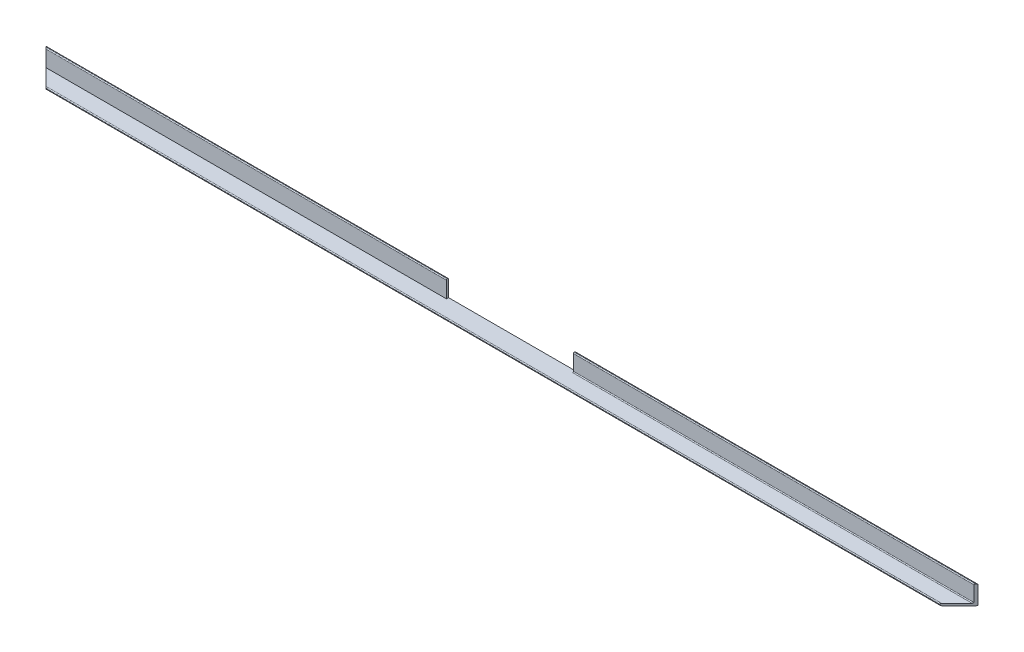
ISO-10303-21;
HEADER;
FILE_DESCRIPTION(('STEP AP214'),'2;1');
FILE_NAME('part.step','',(''),(''),'','','');
FILE_SCHEMA(('AUTOMOTIVE_DESIGN { 1 0 10303 214 1 1 1 1 }'));
ENDSEC;
DATA;
#1=APPLICATION_CONTEXT('core data for automotive mechanical design processes');
#2=APPLICATION_PROTOCOL_DEFINITION('international standard','automotive_design',2000,#1);
#3=PRODUCT_CONTEXT('',#1,'mechanical');
#4=PRODUCT('Part','Part','',(#3));
#5=PRODUCT_RELATED_PRODUCT_CATEGORY('part','',(#4));
#6=PRODUCT_DEFINITION_FORMATION('','',#4);
#7=PRODUCT_DEFINITION_CONTEXT('part definition',#1,'design');
#8=PRODUCT_DEFINITION('design','',#6,#7);
#9=PRODUCT_DEFINITION_SHAPE('','',#8);
#10=(LENGTH_UNIT() NAMED_UNIT(*) SI_UNIT(.MILLI.,.METRE.));
#11=(NAMED_UNIT(*) PLANE_ANGLE_UNIT() SI_UNIT($,.RADIAN.));
#12=(NAMED_UNIT(*) SI_UNIT($,.STERADIAN.) SOLID_ANGLE_UNIT());
#13=UNCERTAINTY_MEASURE_WITH_UNIT(LENGTH_MEASURE(1.E-05),#10,'distance_accuracy_value','');
#14=(GEOMETRIC_REPRESENTATION_CONTEXT(3) GLOBAL_UNCERTAINTY_ASSIGNED_CONTEXT((#13)) GLOBAL_UNIT_ASSIGNED_CONTEXT((#10,
#11,#12)) REPRESENTATION_CONTEXT('',''));
#15=CARTESIAN_POINT('',(0.,0.,0.));
#16=DIRECTION('',(0.,0.,1.));
#17=DIRECTION('',(1.,0.,0.));
#18=AXIS2_PLACEMENT_3D('',#15,#16,#17);
#19=CARTESIAN_POINT('',(-550.,22.5,-8.75));
#20=DIRECTION('',(0.,0.,-1.));
#21=DIRECTION('',(-1.,0.,0.));
#22=AXIS2_PLACEMENT_3D('',#19,#20,#21);
#23=PLANE('',#22);
#24=DIRECTION('',(0.,-1.,0.));
#25=VECTOR('',#24,1.);
#26=CARTESIAN_POINT('',(-75.0000000000002,22.5,-8.75));
#27=LINE('',#26,#25);
#28=CARTESIAN_POINT('',(-75.0000000000002,21.5,-8.75));
#29=VERTEX_POINT('',#28);
#30=CARTESIAN_POINT('',(-75.0000000000002,2.50000000000029,-8.75));
#31=VERTEX_POINT('',#30);
#32=EDGE_CURVE('E281',#29,#31,#27,.T.);
#33=ORIENTED_EDGE('',*,*,#32,.F.);
#34=DIRECTION('',(1.,0.,0.));
#35=VECTOR('',#34,1.);
#36=CARTESIAN_POINT('',(-547.5,21.5,-8.75));
#37=LINE('',#36,#35);
#38=CARTESIAN_POINT('',(-547.5,21.5,-8.75));
#39=VERTEX_POINT('',#38);
#40=EDGE_CURVE('E176',#29,#39,#37,.F.);
#41=ORIENTED_EDGE('',*,*,#40,.T.);
#42=DIRECTION('',(0.,-1.,0.));
#43=VECTOR('',#42,1.);
#44=CARTESIAN_POINT('',(-547.5,22.5,-8.75));
#45=LINE('',#44,#43);
#46=CARTESIAN_POINT('',(-547.5,2.5,-8.75000000000002));
#47=VERTEX_POINT('',#46);
#48=EDGE_CURVE('E159',#39,#47,#45,.T.);
#49=ORIENTED_EDGE('',*,*,#48,.T.);
#50=DIRECTION('',(1.,0.,0.));
#51=VECTOR('',#50,1.);
#52=CARTESIAN_POINT('',(-550.,2.5,-8.75));
#53=LINE('',#52,#51);
#54=EDGE_CURVE('E173',#47,#31,#53,.T.);
#55=ORIENTED_EDGE('',*,*,#54,.T.);
#56=EDGE_LOOP('',(#33,#41,#49,#55));
#57=FACE_BOUND('',#56,.T.);
#58=ADVANCED_FACE('F32',(#57),#23,.F.);
#59=CARTESIAN_POINT('',(0.,22.5,0.));
#60=DIRECTION('',(0.,1.,0.));
#61=DIRECTION('',(0.,0.,1.));
#62=AXIS2_PLACEMENT_3D('',#59,#60,#61);
#63=PLANE('',#62);
#64=DIRECTION('',(0.707106781186543,0.,0.707106781186552));
#65=VECTOR('',#64,1.);
#66=CARTESIAN_POINT('',(-550.,22.5,-11.25));
#67=LINE('',#66,#65);
#68=CARTESIAN_POINT('',(-549.,22.5,-10.25));
#69=VERTEX_POINT('',#68);
#70=CARTESIAN_POINT('',(-548.5,22.5,-9.75000000000002));
#71=VERTEX_POINT('',#70);
#72=EDGE_CURVE('E308',#69,#71,#67,.T.);
#73=ORIENTED_EDGE('',*,*,#72,.T.);
#74=DIRECTION('',(1.,0.,0.));
#75=VECTOR('',#74,1.);
#76=CARTESIAN_POINT('',(-75.0000000000002,22.5,-9.75));
#77=LINE('',#76,#75);
#78=CARTESIAN_POINT('',(-75.0000000000002,22.5,-9.75));
#79=VERTEX_POINT('',#78);
#80=EDGE_CURVE('E208',#71,#79,#77,.T.);
#81=ORIENTED_EDGE('',*,*,#80,.T.);
#82=DIRECTION('',(0.,0.,1.));
#83=VECTOR('',#82,1.);
#84=CARTESIAN_POINT('',(-75.0000000000002,22.5,0.));
#85=LINE('',#84,#83);
#86=CARTESIAN_POINT('',(-75.0000000000002,22.5,-10.25));
#87=VERTEX_POINT('',#86);
#88=EDGE_CURVE('E199',#87,#79,#85,.T.);
#89=ORIENTED_EDGE('',*,*,#88,.F.);
#90=DIRECTION('',(-1.,0.,0.));
#91=VECTOR('',#90,1.);
#92=CARTESIAN_POINT('',(-550.,22.5,-10.25));
#93=LINE('',#92,#91);
#94=EDGE_CURVE('E205',#87,#69,#93,.T.);
#95=ORIENTED_EDGE('',*,*,#94,.T.);
#96=EDGE_LOOP('',(#73,#81,#89,#95));
#97=FACE_BOUND('',#96,.T.);
#98=ADVANCED_FACE('F310',(#97),#63,.T.);
#99=CARTESIAN_POINT('',(-550.,2.5,-11.25));
#100=DIRECTION('',(0.,0.,1.));
#101=DIRECTION('',(1.,0.,0.));
#102=AXIS2_PLACEMENT_3D('',#99,#100,#101);
#103=PLANE('',#102);
#104=DIRECTION('',(0.,-1.,0.));
#105=VECTOR('',#104,1.);
#106=CARTESIAN_POINT('',(-550.,2.5,-11.25));
#107=LINE('',#106,#105);
#108=CARTESIAN_POINT('',(-550.,21.5,-11.25));
#109=VERTEX_POINT('',#108);
#110=CARTESIAN_POINT('',(-550.,1.,-11.25));
#111=VERTEX_POINT('',#110);
#112=EDGE_CURVE('E183',#109,#111,#107,.T.);
#113=ORIENTED_EDGE('',*,*,#112,.F.);
#114=DIRECTION('',(-1.,0.,0.));
#115=VECTOR('',#114,1.);
#116=CARTESIAN_POINT('',(-75.0000000000002,21.5,-11.25));
#117=LINE('',#116,#115);
#118=CARTESIAN_POINT('',(-75.0000000000002,21.5,-11.25));
#119=VERTEX_POINT('',#118);
#120=EDGE_CURVE('E230',#109,#119,#117,.F.);
#121=ORIENTED_EDGE('',*,*,#120,.T.);
#122=DIRECTION('',(0.,-1.,0.));
#123=VECTOR('',#122,1.);
#124=CARTESIAN_POINT('',(-75.0000000000002,2.5,-11.25));
#125=LINE('',#124,#123);
#126=CARTESIAN_POINT('',(-75.0000000000002,2.50000000000029,-11.25));
#127=VERTEX_POINT('',#126);
#128=EDGE_CURVE('E190',#119,#127,#125,.T.);
#129=ORIENTED_EDGE('',*,*,#128,.T.);
#130=DIRECTION('',(1.,0.,0.));
#131=VECTOR('',#130,1.);
#132=CARTESIAN_POINT('',(-550.,2.5,-11.25));
#133=LINE('',#132,#131);
#134=CARTESIAN_POINT('',(74.9999999999998,2.50000000000038,-11.25));
#135=VERTEX_POINT('',#134);
#136=EDGE_CURVE('E184',#127,#135,#133,.T.);
#137=ORIENTED_EDGE('',*,*,#136,.T.);
#138=DIRECTION('',(0.,1.,0.));
#139=VECTOR('',#138,1.);
#140=CARTESIAN_POINT('',(74.9999999999998,2.5,-11.25));
#141=LINE('',#140,#139);
#142=CARTESIAN_POINT('',(74.9999999999998,21.5,-11.25));
#143=VERTEX_POINT('',#142);
#144=EDGE_CURVE('E292',#135,#143,#141,.T.);
#145=ORIENTED_EDGE('',*,*,#144,.T.);
#146=DIRECTION('',(-1.,0.,0.));
#147=VECTOR('',#146,1.);
#148=CARTESIAN_POINT('',(550.,21.5,-11.25));
#149=LINE('',#148,#147);
#150=CARTESIAN_POINT('',(550.,21.5,-11.25));
#151=VERTEX_POINT('',#150);
#152=EDGE_CURVE('E228',#143,#151,#149,.F.);
#153=ORIENTED_EDGE('',*,*,#152,.T.);
#154=DIRECTION('',(0.,-1.,0.));
#155=VECTOR('',#154,1.);
#156=CARTESIAN_POINT('',(550.,2.5,-11.25));
#157=LINE('',#156,#155);
#158=CARTESIAN_POINT('',(550.,1.,-11.25));
#159=VERTEX_POINT('',#158);
#160=EDGE_CURVE('E187',#151,#159,#157,.T.);
#161=ORIENTED_EDGE('',*,*,#160,.T.);
#162=DIRECTION('',(-1.,0.,0.));
#163=VECTOR('',#162,1.);
#164=CARTESIAN_POINT('',(-550.,1.,-11.25));
#165=LINE('',#164,#163);
#166=EDGE_CURVE('E225',#159,#111,#165,.T.);
#167=ORIENTED_EDGE('',*,*,#166,.T.);
#168=EDGE_LOOP('',(#113,#121,#129,#137,#145,#153,#161,#167));
#169=FACE_BOUND('',#168,.T.);
#170=ADVANCED_FACE('F298',(#169),#103,.F.);
#171=CARTESIAN_POINT('',(-550.,2.5,11.25));
#172=DIRECTION('',(0.,0.,-1.));
#173=DIRECTION('',(-1.,0.,0.));
#174=AXIS2_PLACEMENT_3D('',#171,#172,#173);
#175=PLANE('',#174);
#176=DIRECTION('',(0.,-1.,0.));
#177=VECTOR('',#176,1.);
#178=CARTESIAN_POINT('',(-527.5,22.5,11.25));
#179=LINE('',#178,#177);
#180=CARTESIAN_POINT('',(-527.5,1.50000000000001,11.25));
#181=VERTEX_POINT('',#180);
#182=CARTESIAN_POINT('',(-527.5,1.00000000000001,11.25));
#183=VERTEX_POINT('',#182);
#184=EDGE_CURVE('E168',#181,#183,#179,.T.);
#185=ORIENTED_EDGE('',*,*,#184,.T.);
#186=DIRECTION('',(1.,0.,0.));
#187=VECTOR('',#186,1.);
#188=CARTESIAN_POINT('',(-550.,1.,11.25));
#189=LINE('',#188,#187);
#190=CARTESIAN_POINT('',(527.5,1.00000000000001,11.25));
#191=VERTEX_POINT('',#190);
#192=EDGE_CURVE('E234',#183,#191,#189,.T.);
#193=ORIENTED_EDGE('',*,*,#192,.T.);
#194=DIRECTION('',(0.,-1.,0.));
#195=VECTOR('',#194,1.);
#196=CARTESIAN_POINT('',(527.5,22.5,11.25));
#197=LINE('',#196,#195);
#198=CARTESIAN_POINT('',(527.5,1.50000000000001,11.25));
#199=VERTEX_POINT('',#198);
#200=EDGE_CURVE('E322',#199,#191,#197,.T.);
#201=ORIENTED_EDGE('',*,*,#200,.F.);
#202=DIRECTION('',(1.,0.,0.));
#203=VECTOR('',#202,1.);
#204=CARTESIAN_POINT('',(-527.5,1.5,11.25));
#205=LINE('',#204,#203);
#206=EDGE_CURVE('E232',#199,#181,#205,.F.);
#207=ORIENTED_EDGE('',*,*,#206,.T.);
#208=EDGE_LOOP('',(#185,#193,#201,#207));
#209=FACE_BOUND('',#208,.T.);
#210=ADVANCED_FACE('F328',(#209),#175,.F.);
#211=CARTESIAN_POINT('',(0.,2.5,0.));
#212=DIRECTION('',(0.,1.,0.));
#213=DIRECTION('',(0.,0.,1.));
#214=AXIS2_PLACEMENT_3D('',#211,#212,#213);
#215=PLANE('',#214);
#216=DIRECTION('',(-0.707106781186544,0.,-0.707106781186552));
#217=VECTOR('',#216,1.);
#218=CARTESIAN_POINT('',(-269.375000000003,2.5,269.375));
#219=LINE('',#218,#217);
#220=CARTESIAN_POINT('',(-528.5,2.5,10.25));
#221=VERTEX_POINT('',#220);
#222=EDGE_CURVE('E156',#221,#47,#219,.T.);
#223=ORIENTED_EDGE('',*,*,#222,.F.);
#224=DIRECTION('',(1.,0.,0.));
#225=VECTOR('',#224,1.);
#226=CARTESIAN_POINT('',(527.5,2.5,10.25));
#227=LINE('',#226,#225);
#228=CARTESIAN_POINT('',(528.5,2.5,10.25));
#229=VERTEX_POINT('',#228);
#230=EDGE_CURVE('E254',#221,#229,#227,.T.);
#231=ORIENTED_EDGE('',*,*,#230,.T.);
#232=DIRECTION('',(-0.707106781186547,0.,0.707106781186548));
#233=VECTOR('',#232,1.);
#234=CARTESIAN_POINT('',(269.375,2.5,269.375));
#235=LINE('',#234,#233);
#236=CARTESIAN_POINT('',(546.5,2.5,-7.74999999999998));
#237=VERTEX_POINT('',#236);
#238=EDGE_CURVE('E275',#237,#229,#235,.T.);
#239=ORIENTED_EDGE('',*,*,#238,.F.);
#240=DIRECTION('',(1.,0.,0.));
#241=VECTOR('',#240,1.);
#242=CARTESIAN_POINT('',(0.,2.5,-7.75));
#243=LINE('',#242,#241);
#244=CARTESIAN_POINT('',(74.9999999999998,2.50000000000038,-7.75));
#245=VERTEX_POINT('',#244);
#246=EDGE_CURVE('E251',#237,#245,#243,.F.);
#247=ORIENTED_EDGE('',*,*,#246,.T.);
#248=DIRECTION('',(0.,0.,1.));
#249=VECTOR('',#248,1.);
#250=CARTESIAN_POINT('',(74.9999999999998,2.50000000000038,-18.75));
#251=LINE('',#250,#249);
#252=EDGE_CURVE('E288',#135,#245,#251,.T.);
#253=ORIENTED_EDGE('',*,*,#252,.F.);
#254=ORIENTED_EDGE('',*,*,#136,.F.);
#255=DIRECTION('',(0.,0.,1.));
#256=VECTOR('',#255,1.);
#257=CARTESIAN_POINT('',(-75.0000000000002,2.50000000000029,-18.75));
#258=LINE('',#257,#256);
#259=EDGE_CURVE('E182',#127,#31,#258,.T.);
#260=ORIENTED_EDGE('',*,*,#259,.T.);
#261=ORIENTED_EDGE('',*,*,#54,.F.);
#262=EDGE_LOOP('',(#223,#231,#239,#247,#253,#254,#260,#261));
#263=FACE_BOUND('',#262,.T.);
#264=ADVANCED_FACE('F179',(#263),#215,.T.);
#265=CARTESIAN_POINT('',(0.,0.,0.));
#266=DIRECTION('',(0.,1.,0.));
#267=DIRECTION('',(0.,0.,1.));
#268=AXIS2_PLACEMENT_3D('',#265,#266,#267);
#269=PLANE('',#268);
#270=DIRECTION('',(0.707106781186547,0.,-0.707106781186548));
#271=VECTOR('',#270,1.);
#272=CARTESIAN_POINT('',(550.,0.,-11.25));
#273=LINE('',#272,#271);
#274=CARTESIAN_POINT('',(528.5,0.,10.25));
#275=VERTEX_POINT('',#274);
#276=CARTESIAN_POINT('',(549.,0.,-10.25));
#277=VERTEX_POINT('',#276);
#278=EDGE_CURVE('E177',#275,#277,#273,.T.);
#279=ORIENTED_EDGE('',*,*,#278,.F.);
#280=DIRECTION('',(1.,0.,0.));
#281=VECTOR('',#280,1.);
#282=CARTESIAN_POINT('',(0.,0.,10.25));
#283=LINE('',#282,#281);
#284=CARTESIAN_POINT('',(-528.5,0.,10.25));
#285=VERTEX_POINT('',#284);
#286=EDGE_CURVE('E249',#275,#285,#283,.F.);
#287=ORIENTED_EDGE('',*,*,#286,.T.);
#288=DIRECTION('',(0.707106781186543,0.,0.707106781186552));
#289=VECTOR('',#288,1.);
#290=CARTESIAN_POINT('',(-550.,0.,-11.25));
#291=LINE('',#290,#289);
#292=CARTESIAN_POINT('',(-549.,0.,-10.25));
#293=VERTEX_POINT('',#292);
#294=EDGE_CURVE('E313',#293,#285,#291,.T.);
#295=ORIENTED_EDGE('',*,*,#294,.F.);
#296=DIRECTION('',(-1.,0.,0.));
#297=VECTOR('',#296,1.);
#298=CARTESIAN_POINT('',(0.,0.,-10.25));
#299=LINE('',#298,#297);
#300=EDGE_CURVE('E247',#293,#277,#299,.F.);
#301=ORIENTED_EDGE('',*,*,#300,.T.);
#302=EDGE_LOOP('',(#279,#287,#295,#301));
#303=FACE_BOUND('',#302,.T.);
#304=ADVANCED_FACE('F355',(#303),#269,.F.);
#305=DIRECTION('',(0.,1.,0.));
#306=VECTOR('',#305,1.);
#307=CARTESIAN_POINT('',(547.5,22.5,-8.75));
#308=LINE('',#307,#306);
#309=CARTESIAN_POINT('',(547.5,3.5,-8.75));
#310=VERTEX_POINT('',#309);
#311=CARTESIAN_POINT('',(547.5,21.5,-8.75));
#312=VERTEX_POINT('',#311);
#313=EDGE_CURVE('E276',#310,#312,#308,.T.);
#314=ORIENTED_EDGE('',*,*,#313,.T.);
#315=DIRECTION('',(1.,0.,0.));
#316=VECTOR('',#315,1.);
#317=CARTESIAN_POINT('',(74.9999999999998,21.5,-8.75));
#318=LINE('',#317,#316);
#319=CARTESIAN_POINT('',(74.9999999999998,21.5,-8.75));
#320=VERTEX_POINT('',#319);
#321=EDGE_CURVE('E47',#312,#320,#318,.F.);
#322=ORIENTED_EDGE('',*,*,#321,.T.);
#323=DIRECTION('',(0.,1.,0.));
#324=VECTOR('',#323,1.);
#325=CARTESIAN_POINT('',(74.9999999999998,22.5,-8.75));
#326=LINE('',#325,#324);
#327=CARTESIAN_POINT('',(74.9999999999998,3.5,-8.75));
#328=VERTEX_POINT('',#327);
#329=EDGE_CURVE('E285',#328,#320,#326,.T.);
#330=ORIENTED_EDGE('',*,*,#329,.F.);
#331=DIRECTION('',(1.,0.,0.));
#332=VECTOR('',#331,1.);
#333=CARTESIAN_POINT('',(-550.,3.5,-8.75));
#334=LINE('',#333,#332);
#335=EDGE_CURVE('E262',#328,#310,#334,.T.);
#336=ORIENTED_EDGE('',*,*,#335,.T.);
#337=EDGE_LOOP('',(#314,#322,#330,#336));
#338=FACE_BOUND('',#337,.T.);
#339=ADVANCED_FACE('F284',(#338),#23,.F.);
#340=DIRECTION('',(0.,0.,-1.));
#341=VECTOR('',#340,1.);
#342=CARTESIAN_POINT('',(74.9999999999998,22.5,0.));
#343=LINE('',#342,#341);
#344=CARTESIAN_POINT('',(74.9999999999998,22.5,-9.75));
#345=VERTEX_POINT('',#344);
#346=CARTESIAN_POINT('',(74.9999999999998,22.5,-10.25));
#347=VERTEX_POINT('',#346);
#348=EDGE_CURVE('E196',#345,#347,#343,.T.);
#349=ORIENTED_EDGE('',*,*,#348,.F.);
#350=DIRECTION('',(1.,0.,0.));
#351=VECTOR('',#350,1.);
#352=CARTESIAN_POINT('',(547.5,22.5,-9.75));
#353=LINE('',#352,#351);
#354=CARTESIAN_POINT('',(548.5,22.5,-9.75000000000004));
#355=VERTEX_POINT('',#354);
#356=EDGE_CURVE('E259',#345,#355,#353,.T.);
#357=ORIENTED_EDGE('',*,*,#356,.T.);
#358=DIRECTION('',(-0.707106781186547,0.,0.707106781186548));
#359=VECTOR('',#358,1.);
#360=CARTESIAN_POINT('',(269.375,22.5,269.375));
#361=LINE('',#360,#359);
#362=CARTESIAN_POINT('',(549.,22.5,-10.2500000000001));
#363=VERTEX_POINT('',#362);
#364=EDGE_CURVE('E202',#363,#355,#361,.T.);
#365=ORIENTED_EDGE('',*,*,#364,.F.);
#366=DIRECTION('',(-1.,0.,0.));
#367=VECTOR('',#366,1.);
#368=CARTESIAN_POINT('',(74.9999999999998,22.5,-10.25));
#369=LINE('',#368,#367);
#370=EDGE_CURVE('E256',#363,#347,#369,.T.);
#371=ORIENTED_EDGE('',*,*,#370,.T.);
#372=EDGE_LOOP('',(#349,#357,#365,#371));
#373=FACE_BOUND('',#372,.T.);
#374=ADVANCED_FACE('F352',(#373),#63,.T.);
#375=CARTESIAN_POINT('',(-75.0000000000002,22.5,-18.75));
#376=DIRECTION('',(-1.,0.,0.));
#377=DIRECTION('',(0.,0.,1.));
#378=AXIS2_PLACEMENT_3D('',#375,#376,#377);
#379=PLANE('',#378);
#380=ORIENTED_EDGE('',*,*,#88,.T.);
#381=CARTESIAN_POINT('',(-75.0000000000002,21.5,-9.75));
#382=DIRECTION('',(-1.,0.,0.));
#383=DIRECTION('',(0.,0.,1.));
#384=AXIS2_PLACEMENT_3D('',#381,#382,#383);
#385=CIRCLE('',#384,1.);
#386=EDGE_CURVE('E213',#79,#29,#385,.F.);
#387=ORIENTED_EDGE('',*,*,#386,.T.);
#388=ORIENTED_EDGE('',*,*,#32,.T.);
#389=ORIENTED_EDGE('',*,*,#259,.F.);
#390=ORIENTED_EDGE('',*,*,#128,.F.);
#391=CARTESIAN_POINT('',(-75.0000000000002,21.5,-10.25));
#392=DIRECTION('',(-1.,0.,0.));
#393=DIRECTION('',(0.,0.,1.));
#394=AXIS2_PLACEMENT_3D('',#391,#392,#393);
#395=CIRCLE('',#394,1.);
#396=EDGE_CURVE('E211',#119,#87,#395,.F.);
#397=ORIENTED_EDGE('',*,*,#396,.T.);
#398=EDGE_LOOP('',(#380,#387,#388,#389,#390,#397));
#399=FACE_BOUND('',#398,.T.);
#400=ADVANCED_FACE('F302',(#399),#379,.F.);
#401=CARTESIAN_POINT('',(74.9999999999998,22.5,-18.75));
#402=DIRECTION('',(1.,0.,0.));
#403=DIRECTION('',(0.,0.,-1.));
#404=AXIS2_PLACEMENT_3D('',#401,#402,#403);
#405=PLANE('',#404);
#406=ORIENTED_EDGE('',*,*,#329,.T.);
#407=CARTESIAN_POINT('',(74.9999999999998,21.5,-9.75));
#408=DIRECTION('',(1.,0.,0.));
#409=DIRECTION('',(0.,0.,-1.));
#410=AXIS2_PLACEMENT_3D('',#407,#408,#409);
#411=CIRCLE('',#410,1.);
#412=EDGE_CURVE('E268',#320,#345,#411,.F.);
#413=ORIENTED_EDGE('',*,*,#412,.T.);
#414=ORIENTED_EDGE('',*,*,#348,.T.);
#415=CARTESIAN_POINT('',(74.9999999999998,21.5,-10.25));
#416=DIRECTION('',(1.,0.,0.));
#417=DIRECTION('',(0.,0.,-1.));
#418=AXIS2_PLACEMENT_3D('',#415,#416,#417);
#419=CIRCLE('',#418,1.);
#420=EDGE_CURVE('E266',#347,#143,#419,.F.);
#421=ORIENTED_EDGE('',*,*,#420,.T.);
#422=ORIENTED_EDGE('',*,*,#144,.F.);
#423=ORIENTED_EDGE('',*,*,#252,.T.);
#424=CARTESIAN_POINT('',(74.9999999999998,3.5,-7.75));
#425=DIRECTION('',(1.,0.,0.));
#426=DIRECTION('',(0.,0.,-1.));
#427=AXIS2_PLACEMENT_3D('',#424,#425,#426);
#428=CIRCLE('',#427,1.);
#429=EDGE_CURVE('E11',#245,#328,#428,.T.);
#430=ORIENTED_EDGE('',*,*,#429,.T.);
#431=EDGE_LOOP('',(#406,#413,#414,#421,#422,#423,#430));
#432=FACE_BOUND('',#431,.T.);
#433=ADVANCED_FACE('F392',(#432),#405,.F.);
#434=CARTESIAN_POINT('',(550.,22.5,-11.25));
#435=DIRECTION('',(-0.707106781186548,0.,-0.707106781186547));
#436=DIRECTION('',(-0.707106781186547,0.,0.707106781186548));
#437=AXIS2_PLACEMENT_3D('',#434,#435,#436);
#438=PLANE('',#437);
#439=ORIENTED_EDGE('',*,*,#200,.T.);
#440=CARTESIAN_POINT('',(528.5,1.,10.25));
#441=DIRECTION('',(-0.707106781186548,0.,-0.707106781186547));
#442=DIRECTION('',(0.707106781186547,0.,-0.707106781186548));
#443=AXIS2_PLACEMENT_3D('',#440,#441,#442);
#444=ELLIPSE('',#443,1.41421356237309,1.);
#445=EDGE_CURVE('E245',#191,#275,#444,.F.);
#446=ORIENTED_EDGE('',*,*,#445,.T.);
#447=ORIENTED_EDGE('',*,*,#278,.T.);
#448=CARTESIAN_POINT('',(549.,1.,-10.25));
#449=DIRECTION('',(-0.707106781186548,0.,-0.707106781186547));
#450=DIRECTION('',(-0.707106781186547,0.,0.707106781186548));
#451=AXIS2_PLACEMENT_3D('',#448,#449,#450);
#452=ELLIPSE('',#451,1.41421356237309,1.);
#453=EDGE_CURVE('E237',#277,#159,#452,.F.);
#454=ORIENTED_EDGE('',*,*,#453,.T.);
#455=ORIENTED_EDGE('',*,*,#160,.F.);
#456=CARTESIAN_POINT('',(549.,21.5,-10.25));
#457=DIRECTION('',(-0.707106781186548,0.,-0.707106781186547));
#458=DIRECTION('',(0.707106781186547,0.,-0.707106781186548));
#459=AXIS2_PLACEMENT_3D('',#456,#457,#458);
#460=ELLIPSE('',#459,1.41421356237309,1.);
#461=EDGE_CURVE('E239',#151,#363,#460,.F.);
#462=ORIENTED_EDGE('',*,*,#461,.T.);
#463=ORIENTED_EDGE('',*,*,#364,.T.);
#464=CARTESIAN_POINT('',(548.5,21.5,-9.75));
#465=DIRECTION('',(-0.707106781186548,0.,-0.707106781186547));
#466=DIRECTION('',(-0.707106781186547,0.,0.707106781186548));
#467=AXIS2_PLACEMENT_3D('',#464,#465,#466);
#468=ELLIPSE('',#467,1.41421356237309,1.);
#469=EDGE_CURVE('E241',#355,#312,#468,.F.);
#470=ORIENTED_EDGE('',*,*,#469,.T.);
#471=ORIENTED_EDGE('',*,*,#313,.F.);
#472=CARTESIAN_POINT('',(546.5,3.5,-7.75));
#473=DIRECTION('',(-0.707106781186548,0.,-0.707106781186547));
#474=DIRECTION('',(0.707106781186547,0.,-0.707106781186548));
#475=AXIS2_PLACEMENT_3D('',#472,#473,#474);
#476=ELLIPSE('',#475,1.41421356237309,1.);
#477=EDGE_CURVE('E40',#310,#237,#476,.T.);
#478=ORIENTED_EDGE('',*,*,#477,.T.);
#479=ORIENTED_EDGE('',*,*,#238,.T.);
#480=CARTESIAN_POINT('',(528.5,1.5,10.25));
#481=DIRECTION('',(-0.707106781186548,0.,-0.707106781186547));
#482=DIRECTION('',(-0.707106781186547,0.,0.707106781186548));
#483=AXIS2_PLACEMENT_3D('',#480,#481,#482);
#484=ELLIPSE('',#483,1.41421356237309,1.);
#485=EDGE_CURVE('E243',#229,#199,#484,.F.);
#486=ORIENTED_EDGE('',*,*,#485,.T.);
#487=EDGE_LOOP('',(#439,#446,#447,#454,#455,#462,#463,#470,#471,#478,#479,#486));
#488=FACE_BOUND('',#487,.T.);
#489=ADVANCED_FACE('F274',(#488),#438,.F.);
#490=CARTESIAN_POINT('',(-550.,22.5,-11.25));
#491=DIRECTION('',(0.707106781186551,0.,-0.707106781186543));
#492=DIRECTION('',(-0.707106781186544,0.,-0.707106781186552));
#493=AXIS2_PLACEMENT_3D('',#490,#491,#492);
#494=PLANE('',#493);
#495=ORIENTED_EDGE('',*,*,#48,.F.);
#496=CARTESIAN_POINT('',(-548.5,21.5,-9.75));
#497=DIRECTION('',(0.707106781186551,0.,-0.707106781186543));
#498=DIRECTION('',(-0.707106781186544,0.,-0.707106781186552));
#499=AXIS2_PLACEMENT_3D('',#496,#497,#498);
#500=ELLIPSE('',#499,1.41421356237309,1.);
#501=EDGE_CURVE('E223',#39,#71,#500,.F.);
#502=ORIENTED_EDGE('',*,*,#501,.T.);
#503=ORIENTED_EDGE('',*,*,#72,.F.);
#504=CARTESIAN_POINT('',(-549.,21.5,-10.25));
#505=DIRECTION('',(0.707106781186551,0.,-0.707106781186543));
#506=DIRECTION('',(0.707106781186544,0.,0.707106781186552));
#507=AXIS2_PLACEMENT_3D('',#504,#505,#506);
#508=ELLIPSE('',#507,1.41421356237309,1.);
#509=EDGE_CURVE('E221',#69,#109,#508,.F.);
#510=ORIENTED_EDGE('',*,*,#509,.T.);
#511=ORIENTED_EDGE('',*,*,#112,.T.);
#512=CARTESIAN_POINT('',(-549.,1.,-10.25));
#513=DIRECTION('',(0.707106781186551,0.,-0.707106781186543));
#514=DIRECTION('',(-0.707106781186544,0.,-0.707106781186552));
#515=AXIS2_PLACEMENT_3D('',#512,#513,#514);
#516=ELLIPSE('',#515,1.41421356237309,1.);
#517=EDGE_CURVE('E216',#111,#293,#516,.F.);
#518=ORIENTED_EDGE('',*,*,#517,.T.);
#519=ORIENTED_EDGE('',*,*,#294,.T.);
#520=CARTESIAN_POINT('',(-528.5,1.,10.25));
#521=DIRECTION('',(0.707106781186551,0.,-0.707106781186543));
#522=DIRECTION('',(0.707106781186544,0.,0.707106781186552));
#523=AXIS2_PLACEMENT_3D('',#520,#521,#522);
#524=ELLIPSE('',#523,1.41421356237309,1.);
#525=EDGE_CURVE('E219',#285,#183,#524,.F.);
#526=ORIENTED_EDGE('',*,*,#525,.T.);
#527=ORIENTED_EDGE('',*,*,#184,.F.);
#528=CARTESIAN_POINT('',(-528.5,1.5,10.25));
#529=DIRECTION('',(0.707106781186551,0.,-0.707106781186543));
#530=DIRECTION('',(-0.707106781186544,0.,-0.707106781186552));
#531=AXIS2_PLACEMENT_3D('',#528,#529,#530);
#532=ELLIPSE('',#531,1.41421356237309,1.);
#533=EDGE_CURVE('E163',#181,#221,#532,.F.);
#534=ORIENTED_EDGE('',*,*,#533,.T.);
#535=ORIENTED_EDGE('',*,*,#222,.T.);
#536=EDGE_LOOP('',(#495,#502,#503,#510,#511,#518,#519,#526,#527,#534,#535));
#537=FACE_BOUND('',#536,.T.);
#538=ADVANCED_FACE('F158',(#537),#494,.F.);
#539=CARTESIAN_POINT('',(0.,21.5,-9.75));
#540=DIRECTION('',(-1.,0.,0.));
#541=DIRECTION('',(0.,0.,1.));
#542=AXIS2_PLACEMENT_3D('',#539,#540,#541);
#543=CYLINDRICAL_SURFACE('',#542,1.);
#544=ORIENTED_EDGE('',*,*,#501,.F.);
#545=ORIENTED_EDGE('',*,*,#40,.F.);
#546=ORIENTED_EDGE('',*,*,#386,.F.);
#547=ORIENTED_EDGE('',*,*,#80,.F.);
#548=EDGE_LOOP('',(#544,#545,#546,#547));
#549=FACE_BOUND('',#548,.T.);
#550=ADVANCED_FACE('F304',(#549),#543,.T.);
#551=CARTESIAN_POINT('',(0.,21.5,-10.25));
#552=DIRECTION('',(1.,0.,0.));
#553=DIRECTION('',(0.,0.,-1.));
#554=AXIS2_PLACEMENT_3D('',#551,#552,#553);
#555=CYLINDRICAL_SURFACE('',#554,1.);
#556=ORIENTED_EDGE('',*,*,#396,.F.);
#557=ORIENTED_EDGE('',*,*,#120,.F.);
#558=ORIENTED_EDGE('',*,*,#509,.F.);
#559=ORIENTED_EDGE('',*,*,#94,.F.);
#560=EDGE_LOOP('',(#556,#557,#558,#559));
#561=FACE_BOUND('',#560,.T.);
#562=ADVANCED_FACE('F343',(#561),#555,.T.);
#563=CARTESIAN_POINT('',(-550.,1.,10.25));
#564=DIRECTION('',(1.,0.,0.));
#565=DIRECTION('',(0.,0.,-1.));
#566=AXIS2_PLACEMENT_3D('',#563,#564,#565);
#567=CYLINDRICAL_SURFACE('',#566,1.);
#568=ORIENTED_EDGE('',*,*,#525,.F.);
#569=ORIENTED_EDGE('',*,*,#286,.F.);
#570=ORIENTED_EDGE('',*,*,#445,.F.);
#571=ORIENTED_EDGE('',*,*,#192,.F.);
#572=EDGE_LOOP('',(#568,#569,#570,#571));
#573=FACE_BOUND('',#572,.T.);
#574=ADVANCED_FACE('F334',(#573),#567,.T.);
#575=CARTESIAN_POINT('',(0.,1.5,10.25));
#576=DIRECTION('',(-1.,0.,0.));
#577=DIRECTION('',(0.,0.,1.));
#578=AXIS2_PLACEMENT_3D('',#575,#576,#577);
#579=CYLINDRICAL_SURFACE('',#578,1.);
#580=ORIENTED_EDGE('',*,*,#533,.F.);
#581=ORIENTED_EDGE('',*,*,#206,.F.);
#582=ORIENTED_EDGE('',*,*,#485,.F.);
#583=ORIENTED_EDGE('',*,*,#230,.F.);
#584=EDGE_LOOP('',(#580,#581,#582,#583));
#585=FACE_BOUND('',#584,.T.);
#586=ADVANCED_FACE('F331',(#585),#579,.T.);
#587=CARTESIAN_POINT('',(0.,21.5,-9.75));
#588=DIRECTION('',(-1.,0.,0.));
#589=DIRECTION('',(0.,0.,1.));
#590=AXIS2_PLACEMENT_3D('',#587,#588,#589);
#591=CYLINDRICAL_SURFACE('',#590,1.);
#592=ORIENTED_EDGE('',*,*,#412,.F.);
#593=ORIENTED_EDGE('',*,*,#321,.F.);
#594=ORIENTED_EDGE('',*,*,#469,.F.);
#595=ORIENTED_EDGE('',*,*,#356,.F.);
#596=EDGE_LOOP('',(#592,#593,#594,#595));
#597=FACE_BOUND('',#596,.T.);
#598=ADVANCED_FACE('F333',(#597),#591,.T.);
#599=CARTESIAN_POINT('',(0.,21.5,-10.25));
#600=DIRECTION('',(1.,0.,0.));
#601=DIRECTION('',(0.,0.,-1.));
#602=AXIS2_PLACEMENT_3D('',#599,#600,#601);
#603=CYLINDRICAL_SURFACE('',#602,1.);
#604=ORIENTED_EDGE('',*,*,#461,.F.);
#605=ORIENTED_EDGE('',*,*,#152,.F.);
#606=ORIENTED_EDGE('',*,*,#420,.F.);
#607=ORIENTED_EDGE('',*,*,#370,.F.);
#608=EDGE_LOOP('',(#604,#605,#606,#607));
#609=FACE_BOUND('',#608,.T.);
#610=ADVANCED_FACE('F340',(#609),#603,.T.);
#611=CARTESIAN_POINT('',(-550.,3.5,-7.75));
#612=DIRECTION('',(1.,0.,0.));
#613=DIRECTION('',(0.,0.,-1.));
#614=AXIS2_PLACEMENT_3D('',#611,#612,#613);
#615=CYLINDRICAL_SURFACE('',#614,1.);
#616=ORIENTED_EDGE('',*,*,#429,.F.);
#617=ORIENTED_EDGE('',*,*,#246,.F.);
#618=ORIENTED_EDGE('',*,*,#477,.F.);
#619=ORIENTED_EDGE('',*,*,#335,.F.);
#620=EDGE_LOOP('',(#616,#617,#618,#619));
#621=FACE_BOUND('',#620,.T.);
#622=ADVANCED_FACE('F283',(#621),#615,.F.);
#623=CARTESIAN_POINT('',(-550.,1.,-10.25));
#624=DIRECTION('',(-1.,0.,0.));
#625=DIRECTION('',(0.,0.,1.));
#626=AXIS2_PLACEMENT_3D('',#623,#624,#625);
#627=CYLINDRICAL_SURFACE('',#626,1.);
#628=ORIENTED_EDGE('',*,*,#453,.F.);
#629=ORIENTED_EDGE('',*,*,#300,.F.);
#630=ORIENTED_EDGE('',*,*,#517,.F.);
#631=ORIENTED_EDGE('',*,*,#166,.F.);
#632=EDGE_LOOP('',(#628,#629,#630,#631));
#633=FACE_BOUND('',#632,.T.);
#634=ADVANCED_FACE('F34',(#633),#627,.T.);
#635=CLOSED_SHELL('',(#58,#98,#170,#210,#264,#304,#339,#374,#400,#433,#489,#538,#550,#562,#574,
#586,#598,#610,#622,#634));
#636=MANIFOLD_SOLID_BREP('B2',#635);
#637=ADVANCED_BREP_SHAPE_REPRESENTATION('',(#18,#636),#14);
#638=SHAPE_DEFINITION_REPRESENTATION(#9,#637);
ENDSEC;
END-ISO-10303-21;
